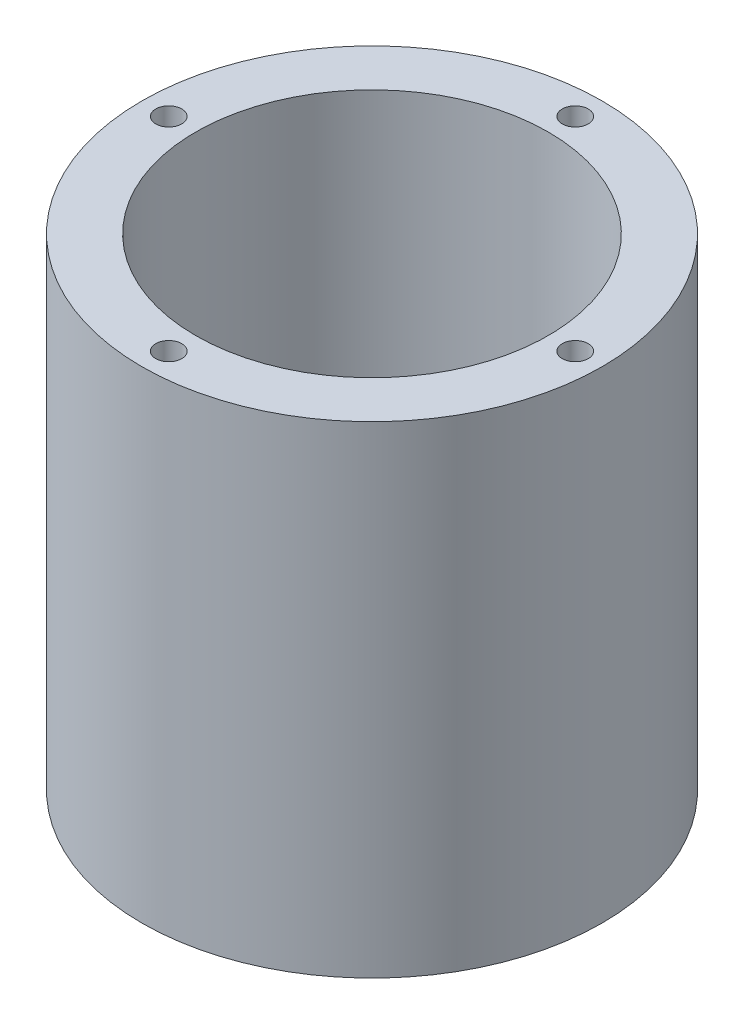
ISO-10303-21;
HEADER;
FILE_DESCRIPTION(('STEP AP214'),'2;1');
FILE_NAME('part.step','',(''),(''),'','','');
FILE_SCHEMA(('AUTOMOTIVE_DESIGN { 1 0 10303 214 1 1 1 1 }'));
ENDSEC;
DATA;
#1=APPLICATION_CONTEXT('core data for automotive mechanical design processes');
#2=APPLICATION_PROTOCOL_DEFINITION('international standard','automotive_design',2000,#1);
#3=PRODUCT_CONTEXT('',#1,'mechanical');
#4=PRODUCT('Part','Part','',(#3));
#5=PRODUCT_RELATED_PRODUCT_CATEGORY('part','',(#4));
#6=PRODUCT_DEFINITION_FORMATION('','',#4);
#7=PRODUCT_DEFINITION_CONTEXT('part definition',#1,'design');
#8=PRODUCT_DEFINITION('design','',#6,#7);
#9=PRODUCT_DEFINITION_SHAPE('','',#8);
#10=(LENGTH_UNIT() NAMED_UNIT(*) SI_UNIT(.MILLI.,.METRE.));
#11=(NAMED_UNIT(*) PLANE_ANGLE_UNIT() SI_UNIT($,.RADIAN.));
#12=(NAMED_UNIT(*) SI_UNIT($,.STERADIAN.) SOLID_ANGLE_UNIT());
#13=UNCERTAINTY_MEASURE_WITH_UNIT(LENGTH_MEASURE(1.E-05),#10,'distance_accuracy_value','');
#14=(GEOMETRIC_REPRESENTATION_CONTEXT(3) GLOBAL_UNCERTAINTY_ASSIGNED_CONTEXT((#13)) GLOBAL_UNIT_ASSIGNED_CONTEXT((#10,
#11,#12)) REPRESENTATION_CONTEXT('',''));
#15=CARTESIAN_POINT('',(0.,0.,0.));
#16=DIRECTION('',(0.,0.,1.));
#17=DIRECTION('',(1.,0.,0.));
#18=AXIS2_PLACEMENT_3D('',#15,#16,#17);
#19=CARTESIAN_POINT('',(-16.6,3.7,-1.15917180449592E-13));
#20=DIRECTION('',(0.,-1.,0.));
#21=DIRECTION('',(0.,0.,-1.));
#22=AXIS2_PLACEMENT_3D('',#19,#20,#21);
#23=CYLINDRICAL_SURFACE('',#22,0.950000000000002);
#24=CARTESIAN_POINT('',(-16.6,3.7,-1.15917180449592E-13));
#25=DIRECTION('',(0.,1.,0.));
#26=DIRECTION('',(0.,0.,1.));
#27=AXIS2_PLACEMENT_3D('',#24,#25,#26);
#28=CIRCLE('',#27,0.950000000000002);
#29=CARTESIAN_POINT('',(-16.6,3.7,0.949999999999886));
#30=VERTEX_POINT('',#29);
#31=EDGE_CURVE('E58',#30,#30,#28,.T.);
#32=ORIENTED_EDGE('',*,*,#31,.T.);
#33=EDGE_LOOP('',(#32));
#34=FACE_BOUND('',#33,.T.);
#35=CARTESIAN_POINT('',(-16.6,0.,-1.15917180449592E-13));
#36=DIRECTION('',(0.,1.,0.));
#37=DIRECTION('',(0.,0.,1.));
#38=AXIS2_PLACEMENT_3D('',#35,#36,#37);
#39=CIRCLE('',#38,0.950000000000002);
#40=CARTESIAN_POINT('',(-16.6,0.,0.949999999999886));
#41=VERTEX_POINT('',#40);
#42=EDGE_CURVE('E85',#41,#41,#39,.T.);
#43=ORIENTED_EDGE('',*,*,#42,.F.);
#44=EDGE_LOOP('',(#43));
#45=FACE_BOUND('',#44,.T.);
#46=ADVANCED_FACE('F45',(#34,#45),#23,.F.);
#47=CARTESIAN_POINT('',(0.,3.7,16.6));
#48=DIRECTION('',(0.,-1.,0.));
#49=DIRECTION('',(0.,0.,-1.));
#50=AXIS2_PLACEMENT_3D('',#47,#48,#49);
#51=CYLINDRICAL_SURFACE('',#50,0.95);
#52=CARTESIAN_POINT('',(0.,3.7,16.6));
#53=DIRECTION('',(0.,1.,0.));
#54=DIRECTION('',(0.,0.,1.));
#55=AXIS2_PLACEMENT_3D('',#52,#53,#54);
#56=CIRCLE('',#55,0.95);
#57=CARTESIAN_POINT('',(0.,3.7,17.55));
#58=VERTEX_POINT('',#57);
#59=EDGE_CURVE('E64',#58,#58,#56,.T.);
#60=ORIENTED_EDGE('',*,*,#59,.T.);
#61=EDGE_LOOP('',(#60));
#62=FACE_BOUND('',#61,.T.);
#63=CARTESIAN_POINT('',(0.,0.,16.6));
#64=DIRECTION('',(0.,1.,0.));
#65=DIRECTION('',(0.,0.,1.));
#66=AXIS2_PLACEMENT_3D('',#63,#64,#65);
#67=CIRCLE('',#66,0.95);
#68=CARTESIAN_POINT('',(0.,0.,17.55));
#69=VERTEX_POINT('',#68);
#70=EDGE_CURVE('E81',#69,#69,#67,.T.);
#71=ORIENTED_EDGE('',*,*,#70,.F.);
#72=EDGE_LOOP('',(#71));
#73=FACE_BOUND('',#72,.T.);
#74=ADVANCED_FACE('F109',(#62,#73),#51,.F.);
#75=CARTESIAN_POINT('',(16.6,3.7,0.));
#76=DIRECTION('',(0.,-1.,0.));
#77=DIRECTION('',(0.,0.,-1.));
#78=AXIS2_PLACEMENT_3D('',#75,#76,#77);
#79=CYLINDRICAL_SURFACE('',#78,0.950000000000001);
#80=CARTESIAN_POINT('',(16.6,3.7,0.));
#81=DIRECTION('',(0.,1.,0.));
#82=DIRECTION('',(0.,0.,1.));
#83=AXIS2_PLACEMENT_3D('',#80,#81,#82);
#84=CIRCLE('',#83,0.950000000000001);
#85=CARTESIAN_POINT('',(16.6,3.7,0.950000000000001));
#86=VERTEX_POINT('',#85);
#87=EDGE_CURVE('E96',#86,#86,#84,.T.);
#88=ORIENTED_EDGE('',*,*,#87,.T.);
#89=EDGE_LOOP('',(#88));
#90=FACE_BOUND('',#89,.T.);
#91=CARTESIAN_POINT('',(16.6,0.,0.));
#92=DIRECTION('',(0.,1.,0.));
#93=DIRECTION('',(0.,0.,1.));
#94=AXIS2_PLACEMENT_3D('',#91,#92,#93);
#95=CIRCLE('',#94,0.950000000000001);
#96=CARTESIAN_POINT('',(16.6,0.,0.950000000000001));
#97=VERTEX_POINT('',#96);
#98=EDGE_CURVE('E77',#97,#97,#95,.T.);
#99=ORIENTED_EDGE('',*,*,#98,.F.);
#100=EDGE_LOOP('',(#99));
#101=FACE_BOUND('',#100,.T.);
#102=ADVANCED_FACE('F145',(#90,#101),#79,.F.);
#103=CARTESIAN_POINT('',(0.,3.7,0.));
#104=DIRECTION('',(0.,-1.,0.));
#105=DIRECTION('',(0.,0.,-1.));
#106=AXIS2_PLACEMENT_3D('',#103,#104,#105);
#107=CYLINDRICAL_SURFACE('',#106,4.);
#108=CARTESIAN_POINT('',(0.,3.7,0.));
#109=DIRECTION('',(0.,1.,0.));
#110=DIRECTION('',(0.,0.,1.));
#111=AXIS2_PLACEMENT_3D('',#108,#109,#110);
#112=CIRCLE('',#111,4.);
#113=CARTESIAN_POINT('',(0.,3.7,4.));
#114=VERTEX_POINT('',#113);
#115=EDGE_CURVE('E91',#114,#114,#112,.T.);
#116=ORIENTED_EDGE('',*,*,#115,.T.);
#117=EDGE_LOOP('',(#116));
#118=FACE_BOUND('',#117,.T.);
#119=CARTESIAN_POINT('',(0.,0.,0.));
#120=DIRECTION('',(0.,1.,0.));
#121=DIRECTION('',(0.,0.,1.));
#122=AXIS2_PLACEMENT_3D('',#119,#120,#121);
#123=CIRCLE('',#122,4.);
#124=CARTESIAN_POINT('',(0.,0.,4.));
#125=VERTEX_POINT('',#124);
#126=EDGE_CURVE('E72',#125,#125,#123,.T.);
#127=ORIENTED_EDGE('',*,*,#126,.F.);
#128=EDGE_LOOP('',(#127));
#129=FACE_BOUND('',#128,.T.);
#130=ADVANCED_FACE('F147',(#118,#129),#107,.F.);
#131=CARTESIAN_POINT('',(0.,3.7,0.));
#132=DIRECTION('',(0.,-1.,0.));
#133=DIRECTION('',(0.,0.,-1.));
#134=AXIS2_PLACEMENT_3D('',#131,#132,#133);
#135=CYLINDRICAL_SURFACE('',#134,25.65);
#136=CARTESIAN_POINT('',(0.,0.,0.));
#137=DIRECTION('',(0.,1.,0.));
#138=DIRECTION('',(0.,0.,1.));
#139=AXIS2_PLACEMENT_3D('',#136,#137,#138);
#140=CIRCLE('',#139,25.65);
#141=CARTESIAN_POINT('',(0.,0.,25.65));
#142=VERTEX_POINT('',#141);
#143=EDGE_CURVE('E68',#142,#142,#140,.T.);
#144=ORIENTED_EDGE('',*,*,#143,.T.);
#145=EDGE_LOOP('',(#144));
#146=FACE_BOUND('',#145,.T.);
#147=CARTESIAN_POINT('',(0.,53.7,0.));
#148=DIRECTION('',(0.,1.,0.));
#149=DIRECTION('',(0.,0.,1.));
#150=AXIS2_PLACEMENT_3D('',#147,#148,#149);
#151=CIRCLE('',#150,25.65);
#152=CARTESIAN_POINT('',(0.,53.7,25.65));
#153=VERTEX_POINT('',#152);
#154=EDGE_CURVE('E73',#153,#153,#151,.T.);
#155=ORIENTED_EDGE('',*,*,#154,.F.);
#156=EDGE_LOOP('',(#155));
#157=FACE_BOUND('',#156,.T.);
#158=ADVANCED_FACE('F47',(#146,#157),#135,.T.);
#159=CARTESIAN_POINT('',(1.73875770674388E-13,3.7,-16.6));
#160=DIRECTION('',(0.,-1.,0.));
#161=DIRECTION('',(0.,0.,-1.));
#162=AXIS2_PLACEMENT_3D('',#159,#160,#161);
#163=CYLINDRICAL_SURFACE('',#162,0.950000000000001);
#164=CARTESIAN_POINT('',(1.73875770674388E-13,3.7,-16.6));
#165=DIRECTION('',(0.,1.,0.));
#166=DIRECTION('',(0.,0.,1.));
#167=AXIS2_PLACEMENT_3D('',#164,#165,#166);
#168=CIRCLE('',#167,0.950000000000001);
#169=CARTESIAN_POINT('',(1.73875770674388E-13,3.7,-15.65));
#170=VERTEX_POINT('',#169);
#171=EDGE_CURVE('E53',#170,#170,#168,.T.);
#172=ORIENTED_EDGE('',*,*,#171,.T.);
#173=EDGE_LOOP('',(#172));
#174=FACE_BOUND('',#173,.T.);
#175=CARTESIAN_POINT('',(1.73875770674388E-13,0.,-16.6));
#176=DIRECTION('',(0.,1.,0.));
#177=DIRECTION('',(0.,0.,1.));
#178=AXIS2_PLACEMENT_3D('',#175,#176,#177);
#179=CIRCLE('',#178,0.950000000000001);
#180=CARTESIAN_POINT('',(1.73875770674388E-13,0.,-15.65));
#181=VERTEX_POINT('',#180);
#182=EDGE_CURVE('E88',#181,#181,#179,.T.);
#183=ORIENTED_EDGE('',*,*,#182,.F.);
#184=EDGE_LOOP('',(#183));
#185=FACE_BOUND('',#184,.T.);
#186=ADVANCED_FACE('F116',(#174,#185),#163,.F.);
#187=CARTESIAN_POINT('',(0.,3.7,0.));
#188=DIRECTION('',(0.,1.,0.));
#189=DIRECTION('',(0.,0.,1.));
#190=AXIS2_PLACEMENT_3D('',#187,#188,#189);
#191=PLANE('',#190);
#192=CARTESIAN_POINT('',(0.,3.7,0.));
#193=DIRECTION('',(0.,1.,0.));
#194=DIRECTION('',(0.,0.,1.));
#195=AXIS2_PLACEMENT_3D('',#192,#193,#194);
#196=CIRCLE('',#195,19.65);
#197=CARTESIAN_POINT('',(0.,3.7,19.65));
#198=VERTEX_POINT('',#197);
#199=EDGE_CURVE('E10',#198,#198,#196,.F.);
#200=ORIENTED_EDGE('',*,*,#199,.F.);
#201=EDGE_LOOP('',(#200));
#202=FACE_BOUND('',#201,.T.);
#203=ORIENTED_EDGE('',*,*,#115,.F.);
#204=EDGE_LOOP('',(#203));
#205=FACE_BOUND('',#204,.T.);
#206=ORIENTED_EDGE('',*,*,#87,.F.);
#207=EDGE_LOOP('',(#206));
#208=FACE_BOUND('',#207,.T.);
#209=ORIENTED_EDGE('',*,*,#59,.F.);
#210=EDGE_LOOP('',(#209));
#211=FACE_BOUND('',#210,.T.);
#212=ORIENTED_EDGE('',*,*,#31,.F.);
#213=EDGE_LOOP('',(#212));
#214=FACE_BOUND('',#213,.T.);
#215=ORIENTED_EDGE('',*,*,#171,.F.);
#216=EDGE_LOOP('',(#215));
#217=FACE_BOUND('',#216,.T.);
#218=ADVANCED_FACE('F112',(#202,#205,#208,#211,#214,#217),#191,.T.);
#219=CARTESIAN_POINT('',(0.,0.,0.));
#220=DIRECTION('',(0.,1.,0.));
#221=DIRECTION('',(0.,0.,1.));
#222=AXIS2_PLACEMENT_3D('',#219,#220,#221);
#223=PLANE('',#222);
#224=ORIENTED_EDGE('',*,*,#143,.F.);
#225=EDGE_LOOP('',(#224));
#226=FACE_BOUND('',#225,.T.);
#227=ORIENTED_EDGE('',*,*,#126,.T.);
#228=EDGE_LOOP('',(#227));
#229=FACE_BOUND('',#228,.T.);
#230=ORIENTED_EDGE('',*,*,#98,.T.);
#231=EDGE_LOOP('',(#230));
#232=FACE_BOUND('',#231,.T.);
#233=ORIENTED_EDGE('',*,*,#70,.T.);
#234=EDGE_LOOP('',(#233));
#235=FACE_BOUND('',#234,.T.);
#236=ORIENTED_EDGE('',*,*,#42,.T.);
#237=EDGE_LOOP('',(#236));
#238=FACE_BOUND('',#237,.T.);
#239=ORIENTED_EDGE('',*,*,#182,.T.);
#240=EDGE_LOOP('',(#239));
#241=FACE_BOUND('',#240,.T.);
#242=ADVANCED_FACE('F115',(#226,#229,#232,#235,#238,#241),#223,.F.);
#243=CARTESIAN_POINT('',(0.,53.7,0.));
#244=DIRECTION('',(0.,-1.,0.));
#245=DIRECTION('',(0.,0.,-1.));
#246=AXIS2_PLACEMENT_3D('',#243,#244,#245);
#247=CYLINDRICAL_SURFACE('',#246,19.65);
#248=CARTESIAN_POINT('',(0.,53.7,0.));
#249=DIRECTION('',(0.,1.,0.));
#250=DIRECTION('',(0.,0.,1.));
#251=AXIS2_PLACEMENT_3D('',#248,#249,#250);
#252=CIRCLE('',#251,19.65);
#253=CARTESIAN_POINT('',(0.,53.7,19.65));
#254=VERTEX_POINT('',#253);
#255=EDGE_CURVE('E167',#254,#254,#252,.T.);
#256=ORIENTED_EDGE('',*,*,#255,.T.);
#257=EDGE_LOOP('',(#256));
#258=FACE_BOUND('',#257,.T.);
#259=ORIENTED_EDGE('',*,*,#199,.T.);
#260=EDGE_LOOP('',(#259));
#261=FACE_BOUND('',#260,.T.);
#262=ADVANCED_FACE('F128',(#258,#261),#247,.F.);
#263=CARTESIAN_POINT('',(0.,53.7,0.));
#264=DIRECTION('',(0.,1.,0.));
#265=DIRECTION('',(0.,0.,1.));
#266=AXIS2_PLACEMENT_3D('',#263,#264,#265);
#267=PLANE('',#266);
#268=CARTESIAN_POINT('',(22.65,53.7,0.));
#269=DIRECTION('',(0.,1.,0.));
#270=DIRECTION('',(0.,0.,1.));
#271=AXIS2_PLACEMENT_3D('',#268,#269,#270);
#272=CIRCLE('',#271,1.45);
#273=CARTESIAN_POINT('',(22.65,53.7,1.45));
#274=VERTEX_POINT('',#273);
#275=EDGE_CURVE('E174',#274,#274,#272,.T.);
#276=ORIENTED_EDGE('',*,*,#275,.F.);
#277=EDGE_LOOP('',(#276));
#278=FACE_BOUND('',#277,.T.);
#279=CARTESIAN_POINT('',(0.,53.7,22.65));
#280=DIRECTION('',(0.,1.,0.));
#281=DIRECTION('',(0.,0.,1.));
#282=AXIS2_PLACEMENT_3D('',#279,#280,#281);
#283=CIRCLE('',#282,1.45);
#284=CARTESIAN_POINT('',(0.,53.7,24.1));
#285=VERTEX_POINT('',#284);
#286=EDGE_CURVE('E197',#285,#285,#283,.T.);
#287=ORIENTED_EDGE('',*,*,#286,.F.);
#288=EDGE_LOOP('',(#287));
#289=FACE_BOUND('',#288,.T.);
#290=CARTESIAN_POINT('',(-22.65,53.7,-1.58164104649594E-13));
#291=DIRECTION('',(0.,1.,0.));
#292=DIRECTION('',(0.,0.,1.));
#293=AXIS2_PLACEMENT_3D('',#290,#291,#292);
#294=CIRCLE('',#293,1.45);
#295=CARTESIAN_POINT('',(-22.65,53.7,1.44999999999984));
#296=VERTEX_POINT('',#295);
#297=EDGE_CURVE('E189',#296,#296,#294,.T.);
#298=ORIENTED_EDGE('',*,*,#297,.F.);
#299=EDGE_LOOP('',(#298));
#300=FACE_BOUND('',#299,.T.);
#301=CARTESIAN_POINT('',(2.37246156974391E-13,53.7,-22.65));
#302=DIRECTION('',(0.,1.,0.));
#303=DIRECTION('',(0.,0.,1.));
#304=AXIS2_PLACEMENT_3D('',#301,#302,#303);
#305=CIRCLE('',#304,1.45);
#306=CARTESIAN_POINT('',(2.37246156974391E-13,53.7,-21.2));
#307=VERTEX_POINT('',#306);
#308=EDGE_CURVE('E181',#307,#307,#305,.T.);
#309=ORIENTED_EDGE('',*,*,#308,.F.);
#310=EDGE_LOOP('',(#309));
#311=FACE_BOUND('',#310,.T.);
#312=ORIENTED_EDGE('',*,*,#255,.F.);
#313=EDGE_LOOP('',(#312));
#314=FACE_BOUND('',#313,.T.);
#315=ORIENTED_EDGE('',*,*,#154,.T.);
#316=EDGE_LOOP('',(#315));
#317=FACE_BOUND('',#316,.T.);
#318=ADVANCED_FACE('F136',(#278,#289,#300,#311,#314,#317),#267,.T.);
#319=CARTESIAN_POINT('',(2.37246156974391E-13,38.7,-22.65));
#320=DIRECTION('',(0.,1.,0.));
#321=DIRECTION('',(0.,0.,1.));
#322=AXIS2_PLACEMENT_3D('',#319,#320,#321);
#323=CYLINDRICAL_SURFACE('',#322,1.45);
#324=CARTESIAN_POINT('',(2.37246156974391E-13,38.7,-22.65));
#325=DIRECTION('',(0.,1.,0.));
#326=DIRECTION('',(0.,0.,1.));
#327=AXIS2_PLACEMENT_3D('',#324,#325,#326);
#328=CIRCLE('',#327,1.45);
#329=CARTESIAN_POINT('',(2.37246156974391E-13,38.7,-21.2));
#330=VERTEX_POINT('',#329);
#331=EDGE_CURVE('E177',#330,#330,#328,.T.);
#332=ORIENTED_EDGE('',*,*,#331,.F.);
#333=EDGE_LOOP('',(#332));
#334=FACE_BOUND('',#333,.T.);
#335=ORIENTED_EDGE('',*,*,#308,.T.);
#336=EDGE_LOOP('',(#335));
#337=FACE_BOUND('',#336,.T.);
#338=ADVANCED_FACE('F209',(#334,#337),#323,.F.);
#339=CARTESIAN_POINT('',(2.37246156974391E-13,38.7,-22.65));
#340=DIRECTION('',(0.,1.,0.));
#341=DIRECTION('',(0.,0.,1.));
#342=AXIS2_PLACEMENT_3D('',#339,#340,#341);
#343=PLANE('',#342);
#344=ORIENTED_EDGE('',*,*,#331,.T.);
#345=EDGE_LOOP('',(#344));
#346=FACE_BOUND('',#345,.T.);
#347=ADVANCED_FACE('F219',(#346),#343,.T.);
#348=CARTESIAN_POINT('',(-22.65,38.7,-1.58164104649594E-13));
#349=DIRECTION('',(0.,1.,0.));
#350=DIRECTION('',(0.,0.,1.));
#351=AXIS2_PLACEMENT_3D('',#348,#349,#350);
#352=CYLINDRICAL_SURFACE('',#351,1.45);
#353=CARTESIAN_POINT('',(-22.65,38.7,-1.58164104649594E-13));
#354=DIRECTION('',(0.,1.,0.));
#355=DIRECTION('',(0.,0.,1.));
#356=AXIS2_PLACEMENT_3D('',#353,#354,#355);
#357=CIRCLE('',#356,1.45);
#358=CARTESIAN_POINT('',(-22.65,38.7,1.44999999999984));
#359=VERTEX_POINT('',#358);
#360=EDGE_CURVE('E185',#359,#359,#357,.T.);
#361=ORIENTED_EDGE('',*,*,#360,.F.);
#362=EDGE_LOOP('',(#361));
#363=FACE_BOUND('',#362,.T.);
#364=ORIENTED_EDGE('',*,*,#297,.T.);
#365=EDGE_LOOP('',(#364));
#366=FACE_BOUND('',#365,.T.);
#367=ADVANCED_FACE('F225',(#363,#366),#352,.F.);
#368=CARTESIAN_POINT('',(-22.65,38.7,-1.58164104649594E-13));
#369=DIRECTION('',(0.,1.,0.));
#370=DIRECTION('',(0.,0.,1.));
#371=AXIS2_PLACEMENT_3D('',#368,#369,#370);
#372=PLANE('',#371);
#373=ORIENTED_EDGE('',*,*,#360,.T.);
#374=EDGE_LOOP('',(#373));
#375=FACE_BOUND('',#374,.T.);
#376=ADVANCED_FACE('F230',(#375),#372,.T.);
#377=CARTESIAN_POINT('',(0.,38.7,22.65));
#378=DIRECTION('',(0.,1.,0.));
#379=DIRECTION('',(0.,0.,1.));
#380=AXIS2_PLACEMENT_3D('',#377,#378,#379);
#381=CYLINDRICAL_SURFACE('',#380,1.45);
#382=CARTESIAN_POINT('',(0.,38.7,22.65));
#383=DIRECTION('',(0.,1.,0.));
#384=DIRECTION('',(0.,0.,1.));
#385=AXIS2_PLACEMENT_3D('',#382,#383,#384);
#386=CIRCLE('',#385,1.45);
#387=CARTESIAN_POINT('',(0.,38.7,24.1));
#388=VERTEX_POINT('',#387);
#389=EDGE_CURVE('E193',#388,#388,#386,.T.);
#390=ORIENTED_EDGE('',*,*,#389,.F.);
#391=EDGE_LOOP('',(#390));
#392=FACE_BOUND('',#391,.T.);
#393=ORIENTED_EDGE('',*,*,#286,.T.);
#394=EDGE_LOOP('',(#393));
#395=FACE_BOUND('',#394,.T.);
#396=ADVANCED_FACE('F233',(#392,#395),#381,.F.);
#397=CARTESIAN_POINT('',(0.,38.7,22.65));
#398=DIRECTION('',(0.,1.,0.));
#399=DIRECTION('',(0.,0.,1.));
#400=AXIS2_PLACEMENT_3D('',#397,#398,#399);
#401=PLANE('',#400);
#402=ORIENTED_EDGE('',*,*,#389,.T.);
#403=EDGE_LOOP('',(#402));
#404=FACE_BOUND('',#403,.T.);
#405=ADVANCED_FACE('F238',(#404),#401,.T.);
#406=CARTESIAN_POINT('',(22.65,38.7,0.));
#407=DIRECTION('',(0.,1.,0.));
#408=DIRECTION('',(0.,0.,1.));
#409=AXIS2_PLACEMENT_3D('',#406,#407,#408);
#410=CYLINDRICAL_SURFACE('',#409,1.45);
#411=CARTESIAN_POINT('',(22.65,38.7,0.));
#412=DIRECTION('',(0.,1.,0.));
#413=DIRECTION('',(0.,0.,1.));
#414=AXIS2_PLACEMENT_3D('',#411,#412,#413);
#415=CIRCLE('',#414,1.45);
#416=CARTESIAN_POINT('',(22.65,38.7,1.45));
#417=VERTEX_POINT('',#416);
#418=EDGE_CURVE('E170',#417,#417,#415,.T.);
#419=ORIENTED_EDGE('',*,*,#418,.F.);
#420=EDGE_LOOP('',(#419));
#421=FACE_BOUND('',#420,.T.);
#422=ORIENTED_EDGE('',*,*,#275,.T.);
#423=EDGE_LOOP('',(#422));
#424=FACE_BOUND('',#423,.T.);
#425=ADVANCED_FACE('F205',(#421,#424),#410,.F.);
#426=CARTESIAN_POINT('',(22.65,38.7,0.));
#427=DIRECTION('',(0.,1.,0.));
#428=DIRECTION('',(0.,0.,1.));
#429=AXIS2_PLACEMENT_3D('',#426,#427,#428);
#430=PLANE('',#429);
#431=ORIENTED_EDGE('',*,*,#418,.T.);
#432=EDGE_LOOP('',(#431));
#433=FACE_BOUND('',#432,.T.);
#434=ADVANCED_FACE('F247',(#433),#430,.T.);
#435=CLOSED_SHELL('',(#46,#74,#102,#130,#158,#186,#218,#242,#262,#318,#338,#347,#367,#376,#396,
#405,#425,#434));
#436=MANIFOLD_SOLID_BREP('B2',#435);
#437=ADVANCED_BREP_SHAPE_REPRESENTATION('',(#18,#436),#14);
#438=SHAPE_DEFINITION_REPRESENTATION(#9,#437);
ENDSEC;
END-ISO-10303-21;
